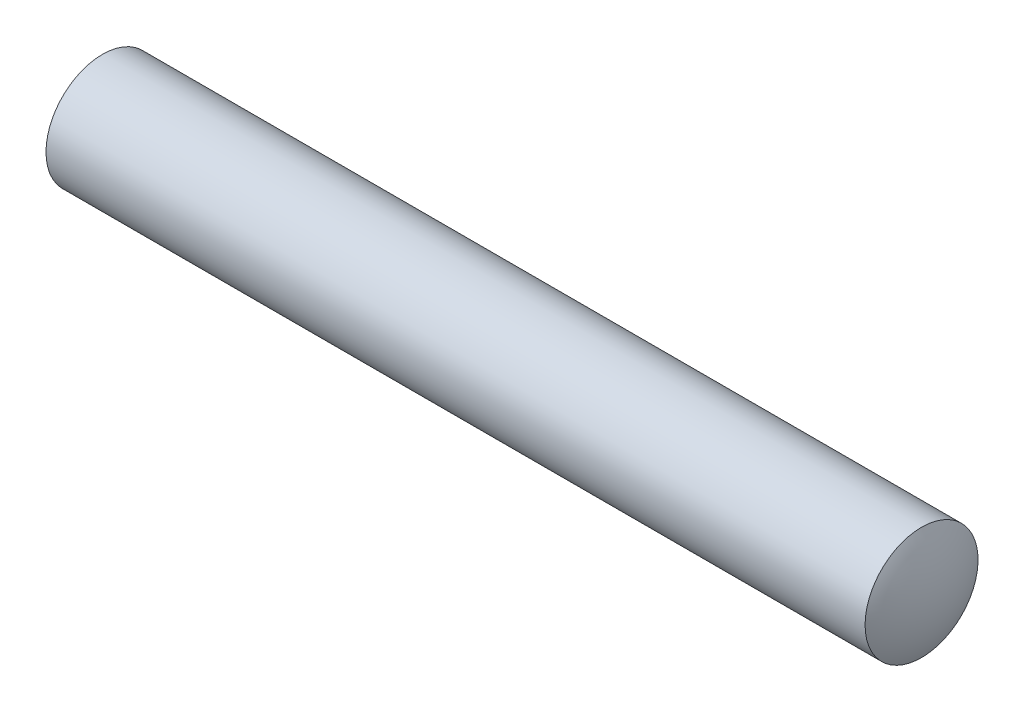
ISO-10303-21;
HEADER;
FILE_DESCRIPTION(('STEP AP214'),'2;1');
FILE_NAME('part.step','',(''),(''),'','','');
FILE_SCHEMA(('AUTOMOTIVE_DESIGN { 1 0 10303 214 1 1 1 1 }'));
ENDSEC;
DATA;
#1=APPLICATION_CONTEXT('core data for automotive mechanical design processes');
#2=APPLICATION_PROTOCOL_DEFINITION('international standard','automotive_design',2000,#1);
#3=PRODUCT_CONTEXT('',#1,'mechanical');
#4=PRODUCT('Part','Part','',(#3));
#5=PRODUCT_RELATED_PRODUCT_CATEGORY('part','',(#4));
#6=PRODUCT_DEFINITION_FORMATION('','',#4);
#7=PRODUCT_DEFINITION_CONTEXT('part definition',#1,'design');
#8=PRODUCT_DEFINITION('design','',#6,#7);
#9=PRODUCT_DEFINITION_SHAPE('','',#8);
#10=(LENGTH_UNIT() NAMED_UNIT(*) SI_UNIT(.MILLI.,.METRE.));
#11=(NAMED_UNIT(*) PLANE_ANGLE_UNIT() SI_UNIT($,.RADIAN.));
#12=(NAMED_UNIT(*) SI_UNIT($,.STERADIAN.) SOLID_ANGLE_UNIT());
#13=UNCERTAINTY_MEASURE_WITH_UNIT(LENGTH_MEASURE(1.E-05),#10,'distance_accuracy_value','');
#14=(GEOMETRIC_REPRESENTATION_CONTEXT(3) GLOBAL_UNCERTAINTY_ASSIGNED_CONTEXT((#13)) GLOBAL_UNIT_ASSIGNED_CONTEXT((#10,
#11,#12)) REPRESENTATION_CONTEXT('',''));
#15=CARTESIAN_POINT('',(0.,0.,0.));
#16=DIRECTION('',(0.,0.,1.));
#17=DIRECTION('',(1.,0.,0.));
#18=AXIS2_PLACEMENT_3D('',#15,#16,#17);
#19=CARTESIAN_POINT('',(-4.25,0.,0.));
#20=DIRECTION('',(-1.,0.,0.));
#21=DIRECTION('',(0.,1.,0.));
#22=AXIS2_PLACEMENT_3D('',#19,#20,#21);
#23=SPHERICAL_SURFACE('',#22,4.25);
#24=CARTESIAN_POINT('',(-0.5,0.,0.));
#25=DIRECTION('',(-1.,0.,0.));
#26=DIRECTION('',(0.,0.,1.));
#27=AXIS2_PLACEMENT_3D('',#24,#25,#26);
#28=CIRCLE('',#27,2.);
#29=CARTESIAN_POINT('',(-0.5,0.,2.));
#30=VERTEX_POINT('',#29);
#31=EDGE_CURVE('E10',#30,#30,#28,.T.);
#32=ORIENTED_EDGE('',*,*,#31,.F.);
#33=EDGE_LOOP('',(#32));
#34=FACE_BOUND('',#33,.T.);
#35=ADVANCED_FACE('F36',(#34),#23,.T.);
#36=CARTESIAN_POINT('',(-31.9881208374824,0.,0.));
#37=DIRECTION('',(-1.,0.,0.));
#38=DIRECTION('',(0.,0.,1.));
#39=AXIS2_PLACEMENT_3D('',#36,#37,#38);
#40=CYLINDRICAL_SURFACE('',#39,2.);
#41=CARTESIAN_POINT('',(-29.5,0.,0.));
#42=DIRECTION('',(-1.,0.,0.));
#43=DIRECTION('',(0.,0.,1.));
#44=AXIS2_PLACEMENT_3D('',#41,#42,#43);
#45=CIRCLE('',#44,2.);
#46=CARTESIAN_POINT('',(-29.5,0.,2.));
#47=VERTEX_POINT('',#46);
#48=EDGE_CURVE('E42',#47,#47,#45,.T.);
#49=ORIENTED_EDGE('',*,*,#48,.F.);
#50=EDGE_LOOP('',(#49));
#51=FACE_BOUND('',#50,.T.);
#52=ORIENTED_EDGE('',*,*,#31,.T.);
#53=EDGE_LOOP('',(#52));
#54=FACE_BOUND('',#53,.T.);
#55=ADVANCED_FACE('F50',(#51,#54),#40,.T.);
#56=CARTESIAN_POINT('',(-25.75,0.,0.));
#57=DIRECTION('',(-1.,0.,0.));
#58=DIRECTION('',(0.,1.,0.));
#59=AXIS2_PLACEMENT_3D('',#56,#57,#58);
#60=SPHERICAL_SURFACE('',#59,4.25);
#61=ORIENTED_EDGE('',*,*,#48,.T.);
#62=EDGE_LOOP('',(#61));
#63=FACE_BOUND('',#62,.T.);
#64=ADVANCED_FACE('F48',(#63),#60,.T.);
#65=CLOSED_SHELL('',(#35,#55,#64));
#66=MANIFOLD_SOLID_BREP('B2',#65);
#67=ADVANCED_BREP_SHAPE_REPRESENTATION('',(#18,#66),#14);
#68=SHAPE_DEFINITION_REPRESENTATION(#9,#67);
ENDSEC;
END-ISO-10303-21;
